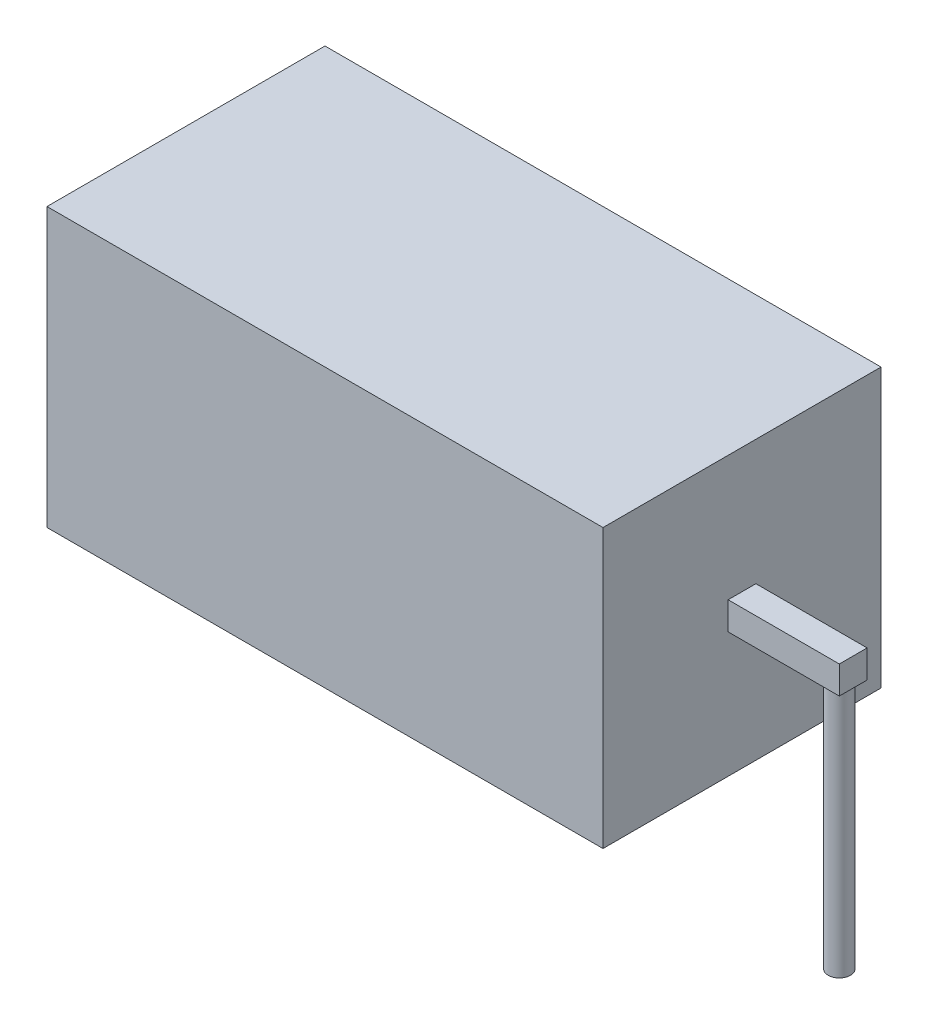
ISO-10303-21;
HEADER;
FILE_DESCRIPTION(('STEP AP214'),'2;1');
FILE_NAME('part.step','',(''),(''),'','','');
FILE_SCHEMA(('AUTOMOTIVE_DESIGN { 1 0 10303 214 1 1 1 1 }'));
ENDSEC;
DATA;
#1=APPLICATION_CONTEXT('core data for automotive mechanical design processes');
#2=APPLICATION_PROTOCOL_DEFINITION('international standard','automotive_design',2000,#1);
#3=PRODUCT_CONTEXT('',#1,'mechanical');
#4=PRODUCT('Part','Part','',(#3));
#5=PRODUCT_RELATED_PRODUCT_CATEGORY('part','',(#4));
#6=PRODUCT_DEFINITION_FORMATION('','',#4);
#7=PRODUCT_DEFINITION_CONTEXT('part definition',#1,'design');
#8=PRODUCT_DEFINITION('design','',#6,#7);
#9=PRODUCT_DEFINITION_SHAPE('','',#8);
#10=(LENGTH_UNIT() NAMED_UNIT(*) SI_UNIT(.MILLI.,.METRE.));
#11=(NAMED_UNIT(*) PLANE_ANGLE_UNIT() SI_UNIT($,.RADIAN.));
#12=(NAMED_UNIT(*) SI_UNIT($,.STERADIAN.) SOLID_ANGLE_UNIT());
#13=UNCERTAINTY_MEASURE_WITH_UNIT(LENGTH_MEASURE(1.E-05),#10,'distance_accuracy_value','');
#14=(GEOMETRIC_REPRESENTATION_CONTEXT(3) GLOBAL_UNCERTAINTY_ASSIGNED_CONTEXT((#13)) GLOBAL_UNIT_ASSIGNED_CONTEXT((#10,
#11,#12)) REPRESENTATION_CONTEXT('',''));
#15=CARTESIAN_POINT('',(0.,0.,0.));
#16=DIRECTION('',(0.,0.,1.));
#17=DIRECTION('',(1.,0.,0.));
#18=AXIS2_PLACEMENT_3D('',#15,#16,#17);
#19=CARTESIAN_POINT('',(24.,4.5,5.5));
#20=DIRECTION('',(0.,1.,0.));
#21=DIRECTION('',(0.,0.,1.));
#22=AXIS2_PLACEMENT_3D('',#19,#20,#21);
#23=PLANE('',#22);
#24=DIRECTION('',(-1.,0.,0.));
#25=VECTOR('',#24,1.);
#26=CARTESIAN_POINT('',(24.,4.5,5.5));
#27=LINE('',#26,#25);
#28=CARTESIAN_POINT('',(24.,4.5,5.5));
#29=VERTEX_POINT('',#28);
#30=CARTESIAN_POINT('',(20.,4.5,5.5));
#31=VERTEX_POINT('',#30);
#32=EDGE_CURVE('E126',#29,#31,#27,.T.);
#33=ORIENTED_EDGE('',*,*,#32,.T.);
#34=DIRECTION('',(0.,0.,-1.));
#35=VECTOR('',#34,1.);
#36=CARTESIAN_POINT('',(20.,4.5,10.));
#37=LINE('',#36,#35);
#38=CARTESIAN_POINT('',(20.,4.5,4.5));
#39=VERTEX_POINT('',#38);
#40=EDGE_CURVE('E215',#31,#39,#37,.T.);
#41=ORIENTED_EDGE('',*,*,#40,.T.);
#42=DIRECTION('',(-1.,0.,0.));
#43=VECTOR('',#42,1.);
#44=CARTESIAN_POINT('',(24.,4.5,4.5));
#45=LINE('',#44,#43);
#46=CARTESIAN_POINT('',(24.,4.5,4.5));
#47=VERTEX_POINT('',#46);
#48=EDGE_CURVE('E127',#47,#39,#45,.T.);
#49=ORIENTED_EDGE('',*,*,#48,.F.);
#50=DIRECTION('',(0.,0.,-1.));
#51=VECTOR('',#50,1.);
#52=CARTESIAN_POINT('',(24.,4.5,5.5));
#53=LINE('',#52,#51);
#54=EDGE_CURVE('E155',#29,#47,#53,.T.);
#55=ORIENTED_EDGE('',*,*,#54,.F.);
#56=EDGE_LOOP('',(#33,#41,#49,#55));
#57=FACE_BOUND('',#56,.T.);
#58=CARTESIAN_POINT('',(23.5,4.5,5.));
#59=DIRECTION('',(0.,1.,0.));
#60=DIRECTION('',(0.,0.,1.));
#61=AXIS2_PLACEMENT_3D('',#58,#59,#60);
#62=CIRCLE('',#61,0.400000000000001);
#63=CARTESIAN_POINT('',(23.5,4.5,5.4));
#64=VERTEX_POINT('',#63);
#65=EDGE_CURVE('E11',#64,#64,#62,.F.);
#66=ORIENTED_EDGE('',*,*,#65,.F.);
#67=EDGE_LOOP('',(#66));
#68=FACE_BOUND('',#67,.T.);
#69=ADVANCED_FACE('F31',(#57,#68),#23,.F.);
#70=CARTESIAN_POINT('',(0.,4.5,4.5));
#71=VERTEX_POINT('',#70);
#72=CARTESIAN_POINT('',(-4.,4.5,4.5));
#73=VERTEX_POINT('',#72);
#74=EDGE_CURVE('E168',#71,#73,#45,.T.);
#75=ORIENTED_EDGE('',*,*,#74,.F.);
#76=DIRECTION('',(0.,0.,1.));
#77=VECTOR('',#76,1.);
#78=CARTESIAN_POINT('',(0.,4.5,10.));
#79=LINE('',#78,#77);
#80=CARTESIAN_POINT('',(0.,4.5,5.5));
#81=VERTEX_POINT('',#80);
#82=EDGE_CURVE('E50',#71,#81,#79,.T.);
#83=ORIENTED_EDGE('',*,*,#82,.T.);
#84=CARTESIAN_POINT('',(-4.,4.5,5.5));
#85=VERTEX_POINT('',#84);
#86=EDGE_CURVE('E118',#81,#85,#27,.T.);
#87=ORIENTED_EDGE('',*,*,#86,.T.);
#88=DIRECTION('',(0.,0.,-1.));
#89=VECTOR('',#88,1.);
#90=CARTESIAN_POINT('',(-4.,4.5,5.5));
#91=LINE('',#90,#89);
#92=EDGE_CURVE('E123',#85,#73,#91,.T.);
#93=ORIENTED_EDGE('',*,*,#92,.T.);
#94=EDGE_LOOP('',(#75,#83,#87,#93));
#95=FACE_BOUND('',#94,.T.);
#96=CARTESIAN_POINT('',(-3.5,4.5,5.));
#97=DIRECTION('',(0.,1.,0.));
#98=DIRECTION('',(0.,0.,1.));
#99=AXIS2_PLACEMENT_3D('',#96,#97,#98);
#100=CIRCLE('',#99,0.4);
#101=CARTESIAN_POINT('',(-3.5,4.5,5.4));
#102=VERTEX_POINT('',#101);
#103=EDGE_CURVE('E39',#102,#102,#100,.F.);
#104=ORIENTED_EDGE('',*,*,#103,.F.);
#105=EDGE_LOOP('',(#104));
#106=FACE_BOUND('',#105,.T.);
#107=ADVANCED_FACE('F121',(#95,#106),#23,.F.);
#108=CARTESIAN_POINT('',(0.,0.,10.));
#109=DIRECTION('',(1.,0.,0.));
#110=DIRECTION('',(0.,0.,-1.));
#111=AXIS2_PLACEMENT_3D('',#108,#109,#110);
#112=PLANE('',#111);
#113=DIRECTION('',(0.,-1.,0.));
#114=VECTOR('',#113,1.);
#115=CARTESIAN_POINT('',(0.,0.,0.));
#116=LINE('',#115,#114);
#117=CARTESIAN_POINT('',(0.,10.,0.));
#118=VERTEX_POINT('',#117);
#119=CARTESIAN_POINT('',(0.,0.,0.));
#120=VERTEX_POINT('',#119);
#121=EDGE_CURVE('E179',#118,#120,#116,.T.);
#122=ORIENTED_EDGE('',*,*,#121,.T.);
#123=DIRECTION('',(0.,0.,-1.));
#124=VECTOR('',#123,1.);
#125=CARTESIAN_POINT('',(0.,0.,10.));
#126=LINE('',#125,#124);
#127=CARTESIAN_POINT('',(0.,0.,10.));
#128=VERTEX_POINT('',#127);
#129=EDGE_CURVE('E206',#128,#120,#126,.T.);
#130=ORIENTED_EDGE('',*,*,#129,.F.);
#131=DIRECTION('',(0.,-1.,0.));
#132=VECTOR('',#131,1.);
#133=CARTESIAN_POINT('',(0.,0.,10.));
#134=LINE('',#133,#132);
#135=CARTESIAN_POINT('',(0.,10.,10.));
#136=VERTEX_POINT('',#135);
#137=EDGE_CURVE('E180',#136,#128,#134,.T.);
#138=ORIENTED_EDGE('',*,*,#137,.F.);
#139=DIRECTION('',(0.,0.,-1.));
#140=VECTOR('',#139,1.);
#141=CARTESIAN_POINT('',(0.,10.,10.));
#142=LINE('',#141,#140);
#143=EDGE_CURVE('E190',#136,#118,#142,.T.);
#144=ORIENTED_EDGE('',*,*,#143,.T.);
#145=EDGE_LOOP('',(#122,#130,#138,#144));
#146=FACE_BOUND('',#145,.T.);
#147=DIRECTION('',(0.,1.,0.));
#148=VECTOR('',#147,1.);
#149=CARTESIAN_POINT('',(0.,0.,5.5));
#150=LINE('',#149,#148);
#151=CARTESIAN_POINT('',(0.,5.5,5.5));
#152=VERTEX_POINT('',#151);
#153=EDGE_CURVE('E46',#81,#152,#150,.T.);
#154=ORIENTED_EDGE('',*,*,#153,.F.);
#155=ORIENTED_EDGE('',*,*,#82,.F.);
#156=DIRECTION('',(0.,-1.,0.));
#157=VECTOR('',#156,1.);
#158=CARTESIAN_POINT('',(0.,0.,4.5));
#159=LINE('',#158,#157);
#160=CARTESIAN_POINT('',(0.,5.5,4.5));
#161=VERTEX_POINT('',#160);
#162=EDGE_CURVE('E175',#161,#71,#159,.T.);
#163=ORIENTED_EDGE('',*,*,#162,.F.);
#164=DIRECTION('',(0.,0.,-1.));
#165=VECTOR('',#164,1.);
#166=CARTESIAN_POINT('',(0.,5.5,10.));
#167=LINE('',#166,#165);
#168=EDGE_CURVE('E172',#152,#161,#167,.T.);
#169=ORIENTED_EDGE('',*,*,#168,.F.);
#170=EDGE_LOOP('',(#154,#155,#163,#169));
#171=FACE_BOUND('',#170,.T.);
#172=ADVANCED_FACE('F33',(#146,#171),#112,.F.);
#173=CARTESIAN_POINT('',(20.,0.,10.));
#174=DIRECTION('',(-1.,0.,0.));
#175=DIRECTION('',(0.,0.,1.));
#176=AXIS2_PLACEMENT_3D('',#173,#174,#175);
#177=PLANE('',#176);
#178=DIRECTION('',(0.,1.,0.));
#179=VECTOR('',#178,1.);
#180=CARTESIAN_POINT('',(20.,0.,0.));
#181=LINE('',#180,#179);
#182=CARTESIAN_POINT('',(20.,0.,0.));
#183=VERTEX_POINT('',#182);
#184=CARTESIAN_POINT('',(20.,10.,0.));
#185=VERTEX_POINT('',#184);
#186=EDGE_CURVE('E195',#183,#185,#181,.T.);
#187=ORIENTED_EDGE('',*,*,#186,.T.);
#188=DIRECTION('',(0.,0.,-1.));
#189=VECTOR('',#188,1.);
#190=CARTESIAN_POINT('',(20.,10.,10.));
#191=LINE('',#190,#189);
#192=CARTESIAN_POINT('',(20.,10.,10.));
#193=VERTEX_POINT('',#192);
#194=EDGE_CURVE('E200',#193,#185,#191,.T.);
#195=ORIENTED_EDGE('',*,*,#194,.F.);
#196=DIRECTION('',(0.,1.,0.));
#197=VECTOR('',#196,1.);
#198=CARTESIAN_POINT('',(20.,0.,10.));
#199=LINE('',#198,#197);
#200=CARTESIAN_POINT('',(20.,0.,10.));
#201=VERTEX_POINT('',#200);
#202=EDGE_CURVE('E186',#201,#193,#199,.T.);
#203=ORIENTED_EDGE('',*,*,#202,.F.);
#204=DIRECTION('',(0.,0.,-1.));
#205=VECTOR('',#204,1.);
#206=CARTESIAN_POINT('',(20.,0.,10.));
#207=LINE('',#206,#205);
#208=EDGE_CURVE('E203',#201,#183,#207,.T.);
#209=ORIENTED_EDGE('',*,*,#208,.T.);
#210=EDGE_LOOP('',(#187,#195,#203,#209));
#211=FACE_BOUND('',#210,.T.);
#212=DIRECTION('',(0.,-1.,0.));
#213=VECTOR('',#212,1.);
#214=CARTESIAN_POINT('',(20.,0.,5.5));
#215=LINE('',#214,#213);
#216=CARTESIAN_POINT('',(20.,5.5,5.5));
#217=VERTEX_POINT('',#216);
#218=EDGE_CURVE('E218',#217,#31,#215,.T.);
#219=ORIENTED_EDGE('',*,*,#218,.F.);
#220=DIRECTION('',(0.,0.,1.));
#221=VECTOR('',#220,1.);
#222=CARTESIAN_POINT('',(20.,5.5,10.));
#223=LINE('',#222,#221);
#224=CARTESIAN_POINT('',(20.,5.5,4.5));
#225=VERTEX_POINT('',#224);
#226=EDGE_CURVE('E209',#225,#217,#223,.T.);
#227=ORIENTED_EDGE('',*,*,#226,.F.);
#228=DIRECTION('',(0.,1.,0.));
#229=VECTOR('',#228,1.);
#230=CARTESIAN_POINT('',(20.,0.,4.5));
#231=LINE('',#230,#229);
#232=EDGE_CURVE('E212',#39,#225,#231,.T.);
#233=ORIENTED_EDGE('',*,*,#232,.F.);
#234=ORIENTED_EDGE('',*,*,#40,.F.);
#235=EDGE_LOOP('',(#219,#227,#233,#234));
#236=FACE_BOUND('',#235,.T.);
#237=ADVANCED_FACE('F230',(#211,#236),#177,.F.);
#238=CARTESIAN_POINT('',(0.,0.,10.));
#239=DIRECTION('',(0.,1.,0.));
#240=DIRECTION('',(0.,0.,1.));
#241=AXIS2_PLACEMENT_3D('',#238,#239,#240);
#242=PLANE('',#241);
#243=DIRECTION('',(1.,0.,0.));
#244=VECTOR('',#243,1.);
#245=CARTESIAN_POINT('',(0.,0.,0.));
#246=LINE('',#245,#244);
#247=EDGE_CURVE('E193',#120,#183,#246,.T.);
#248=ORIENTED_EDGE('',*,*,#247,.T.);
#249=ORIENTED_EDGE('',*,*,#208,.F.);
#250=DIRECTION('',(1.,0.,0.));
#251=VECTOR('',#250,1.);
#252=CARTESIAN_POINT('',(0.,0.,10.));
#253=LINE('',#252,#251);
#254=EDGE_CURVE('E183',#128,#201,#253,.T.);
#255=ORIENTED_EDGE('',*,*,#254,.F.);
#256=ORIENTED_EDGE('',*,*,#129,.T.);
#257=EDGE_LOOP('',(#248,#249,#255,#256));
#258=FACE_BOUND('',#257,.T.);
#259=ADVANCED_FACE('F252',(#258),#242,.F.);
#260=CARTESIAN_POINT('',(0.,10.,10.));
#261=DIRECTION('',(0.,-1.,0.));
#262=DIRECTION('',(0.,0.,-1.));
#263=AXIS2_PLACEMENT_3D('',#260,#261,#262);
#264=PLANE('',#263);
#265=DIRECTION('',(-1.,0.,0.));
#266=VECTOR('',#265,1.);
#267=CARTESIAN_POINT('',(0.,10.,0.));
#268=LINE('',#267,#266);
#269=EDGE_CURVE('E184',#185,#118,#268,.T.);
#270=ORIENTED_EDGE('',*,*,#269,.T.);
#271=ORIENTED_EDGE('',*,*,#143,.F.);
#272=DIRECTION('',(-1.,0.,0.));
#273=VECTOR('',#272,1.);
#274=CARTESIAN_POINT('',(0.,10.,10.));
#275=LINE('',#274,#273);
#276=EDGE_CURVE('E188',#193,#136,#275,.T.);
#277=ORIENTED_EDGE('',*,*,#276,.F.);
#278=ORIENTED_EDGE('',*,*,#194,.T.);
#279=EDGE_LOOP('',(#270,#271,#277,#278));
#280=FACE_BOUND('',#279,.T.);
#281=ADVANCED_FACE('F244',(#280),#264,.F.);
#282=CARTESIAN_POINT('',(0.,10.,10.));
#283=DIRECTION('',(0.,0.,-1.));
#284=DIRECTION('',(-1.,0.,0.));
#285=AXIS2_PLACEMENT_3D('',#282,#283,#284);
#286=PLANE('',#285);
#287=ORIENTED_EDGE('',*,*,#137,.T.);
#288=ORIENTED_EDGE('',*,*,#254,.T.);
#289=ORIENTED_EDGE('',*,*,#202,.T.);
#290=ORIENTED_EDGE('',*,*,#276,.T.);
#291=EDGE_LOOP('',(#287,#288,#289,#290));
#292=FACE_BOUND('',#291,.T.);
#293=ADVANCED_FACE('F240',(#292),#286,.F.);
#294=CARTESIAN_POINT('',(0.,10.,0.));
#295=DIRECTION('',(0.,0.,-1.));
#296=DIRECTION('',(-1.,0.,0.));
#297=AXIS2_PLACEMENT_3D('',#294,#295,#296);
#298=PLANE('',#297);
#299=ORIENTED_EDGE('',*,*,#121,.F.);
#300=ORIENTED_EDGE('',*,*,#269,.F.);
#301=ORIENTED_EDGE('',*,*,#186,.F.);
#302=ORIENTED_EDGE('',*,*,#247,.F.);
#303=EDGE_LOOP('',(#299,#300,#301,#302));
#304=FACE_BOUND('',#303,.T.);
#305=ADVANCED_FACE('F243',(#304),#298,.T.);
#306=CARTESIAN_POINT('',(24.,5.5,5.5));
#307=DIRECTION('',(-1.,0.,0.));
#308=DIRECTION('',(0.,0.,1.));
#309=AXIS2_PLACEMENT_3D('',#306,#307,#308);
#310=PLANE('',#309);
#311=DIRECTION('',(0.,-1.,0.));
#312=VECTOR('',#311,1.);
#313=CARTESIAN_POINT('',(24.,4.5,5.5));
#314=LINE('',#313,#312);
#315=CARTESIAN_POINT('',(24.,5.5,5.5));
#316=VERTEX_POINT('',#315);
#317=EDGE_CURVE('E152',#316,#29,#314,.T.);
#318=ORIENTED_EDGE('',*,*,#317,.T.);
#319=ORIENTED_EDGE('',*,*,#54,.T.);
#320=DIRECTION('',(0.,1.,0.));
#321=VECTOR('',#320,1.);
#322=CARTESIAN_POINT('',(24.,4.5,4.5));
#323=LINE('',#322,#321);
#324=CARTESIAN_POINT('',(24.,5.5,4.5));
#325=VERTEX_POINT('',#324);
#326=EDGE_CURVE('E157',#47,#325,#323,.T.);
#327=ORIENTED_EDGE('',*,*,#326,.T.);
#328=DIRECTION('',(0.,0.,1.));
#329=VECTOR('',#328,1.);
#330=CARTESIAN_POINT('',(24.,5.5,5.5));
#331=LINE('',#330,#329);
#332=EDGE_CURVE('E159',#325,#316,#331,.T.);
#333=ORIENTED_EDGE('',*,*,#332,.T.);
#334=EDGE_LOOP('',(#318,#319,#327,#333));
#335=FACE_BOUND('',#334,.T.);
#336=ADVANCED_FACE('F248',(#335),#310,.F.);
#337=CARTESIAN_POINT('',(24.,5.5,5.5));
#338=DIRECTION('',(0.,-1.,0.));
#339=DIRECTION('',(0.,0.,-1.));
#340=AXIS2_PLACEMENT_3D('',#337,#338,#339);
#341=PLANE('',#340);
#342=DIRECTION('',(-1.,0.,0.));
#343=VECTOR('',#342,1.);
#344=CARTESIAN_POINT('',(24.,5.5,4.5));
#345=LINE('',#344,#343);
#346=EDGE_CURVE('E165',#325,#225,#345,.T.);
#347=ORIENTED_EDGE('',*,*,#346,.T.);
#348=ORIENTED_EDGE('',*,*,#226,.T.);
#349=DIRECTION('',(-1.,0.,0.));
#350=VECTOR('',#349,1.);
#351=CARTESIAN_POINT('',(24.,5.5,5.5));
#352=LINE('',#351,#350);
#353=EDGE_CURVE('E161',#316,#217,#352,.T.);
#354=ORIENTED_EDGE('',*,*,#353,.F.);
#355=ORIENTED_EDGE('',*,*,#332,.F.);
#356=EDGE_LOOP('',(#347,#348,#354,#355));
#357=FACE_BOUND('',#356,.T.);
#358=ADVANCED_FACE('F275',(#357),#341,.F.);
#359=CARTESIAN_POINT('',(24.,4.5,4.5));
#360=DIRECTION('',(0.,0.,1.));
#361=DIRECTION('',(1.,0.,0.));
#362=AXIS2_PLACEMENT_3D('',#359,#360,#361);
#363=PLANE('',#362);
#364=ORIENTED_EDGE('',*,*,#48,.T.);
#365=ORIENTED_EDGE('',*,*,#232,.T.);
#366=ORIENTED_EDGE('',*,*,#346,.F.);
#367=ORIENTED_EDGE('',*,*,#326,.F.);
#368=EDGE_LOOP('',(#364,#365,#366,#367));
#369=FACE_BOUND('',#368,.T.);
#370=ADVANCED_FACE('F283',(#369),#363,.F.);
#371=CARTESIAN_POINT('',(24.,4.5,5.5));
#372=DIRECTION('',(0.,0.,-1.));
#373=DIRECTION('',(-1.,0.,0.));
#374=AXIS2_PLACEMENT_3D('',#371,#372,#373);
#375=PLANE('',#374);
#376=ORIENTED_EDGE('',*,*,#353,.T.);
#377=ORIENTED_EDGE('',*,*,#218,.T.);
#378=ORIENTED_EDGE('',*,*,#32,.F.);
#379=ORIENTED_EDGE('',*,*,#317,.F.);
#380=EDGE_LOOP('',(#376,#377,#378,#379));
#381=FACE_BOUND('',#380,.T.);
#382=ADVANCED_FACE('F239',(#381),#375,.F.);
#383=ORIENTED_EDGE('',*,*,#86,.F.);
#384=ORIENTED_EDGE('',*,*,#153,.T.);
#385=CARTESIAN_POINT('',(-4.,5.5,5.5));
#386=VERTEX_POINT('',#385);
#387=EDGE_CURVE('E141',#152,#386,#352,.T.);
#388=ORIENTED_EDGE('',*,*,#387,.T.);
#389=DIRECTION('',(0.,-1.,0.));
#390=VECTOR('',#389,1.);
#391=CARTESIAN_POINT('',(-4.,4.5,5.5));
#392=LINE('',#391,#390);
#393=EDGE_CURVE('E134',#386,#85,#392,.T.);
#394=ORIENTED_EDGE('',*,*,#393,.T.);
#395=EDGE_LOOP('',(#383,#384,#388,#394));
#396=FACE_BOUND('',#395,.T.);
#397=ADVANCED_FACE('F139',(#396),#375,.F.);
#398=CARTESIAN_POINT('',(-4.,5.5,4.5));
#399=VERTEX_POINT('',#398);
#400=EDGE_CURVE('E164',#161,#399,#345,.T.);
#401=ORIENTED_EDGE('',*,*,#400,.F.);
#402=ORIENTED_EDGE('',*,*,#162,.T.);
#403=ORIENTED_EDGE('',*,*,#74,.T.);
#404=DIRECTION('',(0.,1.,0.));
#405=VECTOR('',#404,1.);
#406=CARTESIAN_POINT('',(-4.,4.5,4.5));
#407=LINE('',#406,#405);
#408=EDGE_CURVE('E137',#73,#399,#407,.T.);
#409=ORIENTED_EDGE('',*,*,#408,.T.);
#410=EDGE_LOOP('',(#401,#402,#403,#409));
#411=FACE_BOUND('',#410,.T.);
#412=ADVANCED_FACE('F235',(#411),#363,.F.);
#413=ORIENTED_EDGE('',*,*,#387,.F.);
#414=ORIENTED_EDGE('',*,*,#168,.T.);
#415=ORIENTED_EDGE('',*,*,#400,.T.);
#416=DIRECTION('',(0.,0.,1.));
#417=VECTOR('',#416,1.);
#418=CARTESIAN_POINT('',(-4.,5.5,5.5));
#419=LINE('',#418,#417);
#420=EDGE_CURVE('E150',#399,#386,#419,.T.);
#421=ORIENTED_EDGE('',*,*,#420,.T.);
#422=EDGE_LOOP('',(#413,#414,#415,#421));
#423=FACE_BOUND('',#422,.T.);
#424=ADVANCED_FACE('F308',(#423),#341,.F.);
#425=CARTESIAN_POINT('',(-4.,5.5,5.5));
#426=DIRECTION('',(-1.,0.,0.));
#427=DIRECTION('',(0.,0.,1.));
#428=AXIS2_PLACEMENT_3D('',#425,#426,#427);
#429=PLANE('',#428);
#430=ORIENTED_EDGE('',*,*,#393,.F.);
#431=ORIENTED_EDGE('',*,*,#420,.F.);
#432=ORIENTED_EDGE('',*,*,#408,.F.);
#433=ORIENTED_EDGE('',*,*,#92,.F.);
#434=EDGE_LOOP('',(#430,#431,#432,#433));
#435=FACE_BOUND('',#434,.T.);
#436=ADVANCED_FACE('F132',(#435),#429,.T.);
#437=CARTESIAN_POINT('',(-3.5,-4.5,5.));
#438=DIRECTION('',(0.,1.,0.));
#439=DIRECTION('',(0.,0.,1.));
#440=AXIS2_PLACEMENT_3D('',#437,#438,#439);
#441=CYLINDRICAL_SURFACE('',#440,0.4);
#442=CARTESIAN_POINT('',(-3.5,-4.5,5.));
#443=DIRECTION('',(0.,-1.,0.));
#444=DIRECTION('',(0.,0.,-1.));
#445=AXIS2_PLACEMENT_3D('',#442,#443,#444);
#446=CIRCLE('',#445,0.4);
#447=CARTESIAN_POINT('',(-3.5,-4.5,4.6));
#448=VERTEX_POINT('',#447);
#449=EDGE_CURVE('E142',#448,#448,#446,.T.);
#450=ORIENTED_EDGE('',*,*,#449,.F.);
#451=EDGE_LOOP('',(#450));
#452=FACE_BOUND('',#451,.T.);
#453=ORIENTED_EDGE('',*,*,#103,.T.);
#454=EDGE_LOOP('',(#453));
#455=FACE_BOUND('',#454,.T.);
#456=ADVANCED_FACE('F223',(#452,#455),#441,.T.);
#457=CARTESIAN_POINT('',(-3.5,-4.5,5.));
#458=DIRECTION('',(0.,-1.,0.));
#459=DIRECTION('',(0.,0.,-1.));
#460=AXIS2_PLACEMENT_3D('',#457,#458,#459);
#461=PLANE('',#460);
#462=ORIENTED_EDGE('',*,*,#449,.T.);
#463=EDGE_LOOP('',(#462));
#464=FACE_BOUND('',#463,.T.);
#465=ADVANCED_FACE('F290',(#464),#461,.T.);
#466=CARTESIAN_POINT('',(23.5,-4.5,5.));
#467=DIRECTION('',(0.,1.,0.));
#468=DIRECTION('',(0.,0.,1.));
#469=AXIS2_PLACEMENT_3D('',#466,#467,#468);
#470=CYLINDRICAL_SURFACE('',#469,0.400000000000001);
#471=CARTESIAN_POINT('',(23.5,-4.5,5.));
#472=DIRECTION('',(0.,-1.,0.));
#473=DIRECTION('',(0.,0.,-1.));
#474=AXIS2_PLACEMENT_3D('',#471,#472,#473);
#475=CIRCLE('',#474,0.400000000000001);
#476=CARTESIAN_POINT('',(23.5,-4.5,4.6));
#477=VERTEX_POINT('',#476);
#478=EDGE_CURVE('E145',#477,#477,#475,.T.);
#479=ORIENTED_EDGE('',*,*,#478,.F.);
#480=EDGE_LOOP('',(#479));
#481=FACE_BOUND('',#480,.T.);
#482=ORIENTED_EDGE('',*,*,#65,.T.);
#483=EDGE_LOOP('',(#482));
#484=FACE_BOUND('',#483,.T.);
#485=ADVANCED_FACE('F287',(#481,#484),#470,.T.);
#486=CARTESIAN_POINT('',(23.5,-4.5,5.));
#487=DIRECTION('',(0.,-1.,0.));
#488=DIRECTION('',(0.,0.,-1.));
#489=AXIS2_PLACEMENT_3D('',#486,#487,#488);
#490=PLANE('',#489);
#491=ORIENTED_EDGE('',*,*,#478,.T.);
#492=EDGE_LOOP('',(#491));
#493=FACE_BOUND('',#492,.T.);
#494=ADVANCED_FACE('F289',(#493),#490,.T.);
#495=CLOSED_SHELL('',(#69,#107,#172,#237,#259,#281,#293,#305,#336,#358,#370,#382,#397,#412,#424,
#436,#456,#465,#485,#494));
#496=MANIFOLD_SOLID_BREP('B2',#495);
#497=ADVANCED_BREP_SHAPE_REPRESENTATION('',(#18,#496),#14);
#498=SHAPE_DEFINITION_REPRESENTATION(#9,#497);
ENDSEC;
END-ISO-10303-21;
